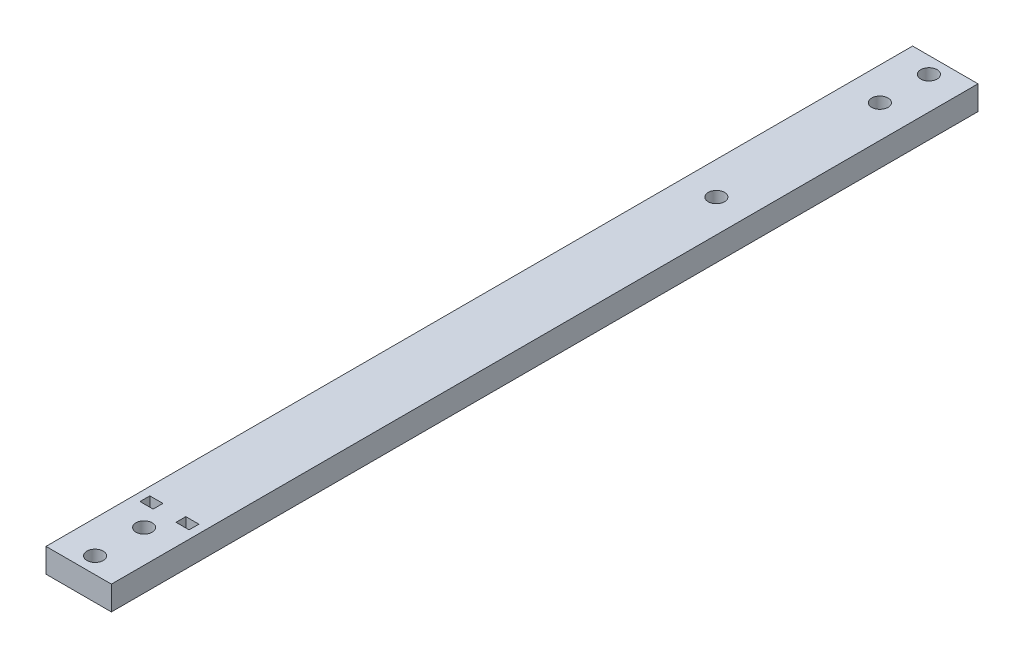
ISO-10303-21;
HEADER;
FILE_DESCRIPTION(('STEP AP214'),'2;1');
FILE_NAME('part.step','',(''),(''),'','','');
FILE_SCHEMA(('AUTOMOTIVE_DESIGN { 1 0 10303 214 1 1 1 1 }'));
ENDSEC;
DATA;
#1=APPLICATION_CONTEXT('core data for automotive mechanical design processes');
#2=APPLICATION_PROTOCOL_DEFINITION('international standard','automotive_design',2000,#1);
#3=PRODUCT_CONTEXT('',#1,'mechanical');
#4=PRODUCT('Part','Part','',(#3));
#5=PRODUCT_RELATED_PRODUCT_CATEGORY('part','',(#4));
#6=PRODUCT_DEFINITION_FORMATION('','',#4);
#7=PRODUCT_DEFINITION_CONTEXT('part definition',#1,'design');
#8=PRODUCT_DEFINITION('design','',#6,#7);
#9=PRODUCT_DEFINITION_SHAPE('','',#8);
#10=(LENGTH_UNIT() NAMED_UNIT(*) SI_UNIT(.MILLI.,.METRE.));
#11=(NAMED_UNIT(*) PLANE_ANGLE_UNIT() SI_UNIT($,.RADIAN.));
#12=(NAMED_UNIT(*) SI_UNIT($,.STERADIAN.) SOLID_ANGLE_UNIT());
#13=UNCERTAINTY_MEASURE_WITH_UNIT(LENGTH_MEASURE(1.E-05),#10,'distance_accuracy_value','');
#14=(GEOMETRIC_REPRESENTATION_CONTEXT(3) GLOBAL_UNCERTAINTY_ASSIGNED_CONTEXT((#13)) GLOBAL_UNIT_ASSIGNED_CONTEXT((#10,
#11,#12)) REPRESENTATION_CONTEXT('',''));
#15=CARTESIAN_POINT('',(0.,0.,0.));
#16=DIRECTION('',(0.,0.,1.));
#17=DIRECTION('',(1.,0.,0.));
#18=AXIS2_PLACEMENT_3D('',#15,#16,#17);
#19=CARTESIAN_POINT('',(0.,2.95,0.));
#20=DIRECTION('',(0.,1.,0.));
#21=DIRECTION('',(0.,0.,1.));
#22=AXIS2_PLACEMENT_3D('',#19,#20,#21);
#23=PLANE('',#22);
#24=CARTESIAN_POINT('',(4.,2.95,2.));
#25=DIRECTION('',(0.,1.,0.));
#26=DIRECTION('',(0.,0.,1.));
#27=AXIS2_PLACEMENT_3D('',#24,#25,#26);
#28=CIRCLE('',#27,1.);
#29=CARTESIAN_POINT('',(4.,2.95,3.));
#30=VERTEX_POINT('',#29);
#31=EDGE_CURVE('E206',#30,#30,#28,.T.);
#32=ORIENTED_EDGE('',*,*,#31,.F.);
#33=EDGE_LOOP('',(#32));
#34=FACE_BOUND('',#33,.T.);
#35=CARTESIAN_POINT('',(4.00000000000001,2.95,104.));
#36=DIRECTION('',(0.,1.,0.));
#37=DIRECTION('',(0.,0.,1.));
#38=AXIS2_PLACEMENT_3D('',#35,#36,#37);
#39=CIRCLE('',#38,0.999999999999998);
#40=CARTESIAN_POINT('',(4.00000000000001,2.95,105.));
#41=VERTEX_POINT('',#40);
#42=EDGE_CURVE('E213',#41,#41,#39,.T.);
#43=ORIENTED_EDGE('',*,*,#42,.F.);
#44=EDGE_LOOP('',(#43));
#45=FACE_BOUND('',#44,.T.);
#46=CARTESIAN_POINT('',(4.00000000000001,2.95,98.));
#47=DIRECTION('',(0.,1.,0.));
#48=DIRECTION('',(0.,0.,1.));
#49=AXIS2_PLACEMENT_3D('',#46,#47,#48);
#50=CIRCLE('',#49,1.);
#51=CARTESIAN_POINT('',(4.00000000000001,2.95,99.));
#52=VERTEX_POINT('',#51);
#53=EDGE_CURVE('E194',#52,#52,#50,.T.);
#54=ORIENTED_EDGE('',*,*,#53,.F.);
#55=EDGE_LOOP('',(#54));
#56=FACE_BOUND('',#55,.T.);
#57=CARTESIAN_POINT('',(4.00000000000001,2.95,28.));
#58=DIRECTION('',(0.,1.,0.));
#59=DIRECTION('',(0.,0.,1.));
#60=AXIS2_PLACEMENT_3D('',#57,#58,#59);
#61=CIRCLE('',#60,1.);
#62=CARTESIAN_POINT('',(4.00000000000001,2.95,29.));
#63=VERTEX_POINT('',#62);
#64=EDGE_CURVE('E201',#63,#63,#61,.T.);
#65=ORIENTED_EDGE('',*,*,#64,.F.);
#66=EDGE_LOOP('',(#65));
#67=FACE_BOUND('',#66,.T.);
#68=CARTESIAN_POINT('',(4.,2.95,8.));
#69=DIRECTION('',(0.,1.,0.));
#70=DIRECTION('',(0.,0.,1.));
#71=AXIS2_PLACEMENT_3D('',#68,#69,#70);
#72=CIRCLE('',#71,1.);
#73=CARTESIAN_POINT('',(4.,2.95,9.));
#74=VERTEX_POINT('',#73);
#75=EDGE_CURVE('E209',#74,#74,#72,.T.);
#76=ORIENTED_EDGE('',*,*,#75,.F.);
#77=EDGE_LOOP('',(#76));
#78=FACE_BOUND('',#77,.T.);
#79=DIRECTION('',(0.,0.,1.));
#80=VECTOR('',#79,1.);
#81=CARTESIAN_POINT('',(0.,2.95,0.));
#82=LINE('',#81,#80);
#83=CARTESIAN_POINT('',(0.,2.95,0.));
#84=VERTEX_POINT('',#83);
#85=CARTESIAN_POINT('',(0.,2.95,106.));
#86=VERTEX_POINT('',#85);
#87=EDGE_CURVE('E240',#84,#86,#82,.T.);
#88=ORIENTED_EDGE('',*,*,#87,.T.);
#89=DIRECTION('',(1.,0.,0.));
#90=VECTOR('',#89,1.);
#91=CARTESIAN_POINT('',(0.,2.95,106.));
#92=LINE('',#91,#90);
#93=CARTESIAN_POINT('',(8.00000000000001,2.95,106.));
#94=VERTEX_POINT('',#93);
#95=EDGE_CURVE('E243',#86,#94,#92,.T.);
#96=ORIENTED_EDGE('',*,*,#95,.T.);
#97=DIRECTION('',(0.,0.,-1.));
#98=VECTOR('',#97,1.);
#99=CARTESIAN_POINT('',(8.,2.95,0.));
#100=LINE('',#99,#98);
#101=CARTESIAN_POINT('',(8.,2.95,0.));
#102=VERTEX_POINT('',#101);
#103=EDGE_CURVE('E246',#94,#102,#100,.T.);
#104=ORIENTED_EDGE('',*,*,#103,.T.);
#105=DIRECTION('',(-1.,0.,0.));
#106=VECTOR('',#105,1.);
#107=CARTESIAN_POINT('',(0.,2.95,0.));
#108=LINE('',#107,#106);
#109=EDGE_CURVE('E248',#102,#84,#108,.T.);
#110=ORIENTED_EDGE('',*,*,#109,.T.);
#111=EDGE_LOOP('',(#88,#96,#104,#110));
#112=FACE_BOUND('',#111,.T.);
#113=DIRECTION('',(1.,0.,0.));
#114=VECTOR('',#113,1.);
#115=CARTESIAN_POINT('',(0.,2.95,94.3));
#116=LINE('',#115,#114);
#117=CARTESIAN_POINT('',(5.40000000000001,2.95,94.3));
#118=VERTEX_POINT('',#117);
#119=CARTESIAN_POINT('',(7.00000000000001,2.95,94.3));
#120=VERTEX_POINT('',#119);
#121=EDGE_CURVE('E180',#118,#120,#116,.T.);
#122=ORIENTED_EDGE('',*,*,#121,.T.);
#123=DIRECTION('',(0.,0.,1.));
#124=VECTOR('',#123,1.);
#125=CARTESIAN_POINT('',(7.00000000000001,2.95,0.));
#126=LINE('',#125,#124);
#127=CARTESIAN_POINT('',(7.00000000000001,2.95,95.5));
#128=VERTEX_POINT('',#127);
#129=EDGE_CURVE('E60',#120,#128,#126,.T.);
#130=ORIENTED_EDGE('',*,*,#129,.T.);
#131=DIRECTION('',(1.,0.,0.));
#132=VECTOR('',#131,1.);
#133=CARTESIAN_POINT('',(0.,2.95,95.5));
#134=LINE('',#133,#132);
#135=CARTESIAN_POINT('',(5.40000000000001,2.95,95.5));
#136=VERTEX_POINT('',#135);
#137=EDGE_CURVE('E170',#136,#128,#134,.T.);
#138=ORIENTED_EDGE('',*,*,#137,.F.);
#139=DIRECTION('',(0.,0.,1.));
#140=VECTOR('',#139,1.);
#141=CARTESIAN_POINT('',(5.40000000000001,2.95,0.));
#142=LINE('',#141,#140);
#143=EDGE_CURVE('E183',#118,#136,#142,.T.);
#144=ORIENTED_EDGE('',*,*,#143,.F.);
#145=EDGE_LOOP('',(#122,#130,#138,#144));
#146=FACE_BOUND('',#145,.T.);
#147=DIRECTION('',(1.,0.,0.));
#148=VECTOR('',#147,1.);
#149=CARTESIAN_POINT('',(0.,2.95,94.3));
#150=LINE('',#149,#148);
#151=CARTESIAN_POINT('',(1.,2.95,94.3));
#152=VERTEX_POINT('',#151);
#153=CARTESIAN_POINT('',(2.6,2.95,94.3));
#154=VERTEX_POINT('',#153);
#155=EDGE_CURVE('E156',#152,#154,#150,.T.);
#156=ORIENTED_EDGE('',*,*,#155,.T.);
#157=DIRECTION('',(0.,0.,1.));
#158=VECTOR('',#157,1.);
#159=CARTESIAN_POINT('',(2.6,2.95,0.));
#160=LINE('',#159,#158);
#161=CARTESIAN_POINT('',(2.6,2.95,95.5));
#162=VERTEX_POINT('',#161);
#163=EDGE_CURVE('E52',#154,#162,#160,.T.);
#164=ORIENTED_EDGE('',*,*,#163,.T.);
#165=DIRECTION('',(1.,0.,0.));
#166=VECTOR('',#165,1.);
#167=CARTESIAN_POINT('',(0.,2.95,95.5));
#168=LINE('',#167,#166);
#169=CARTESIAN_POINT('',(1.,2.95,95.5));
#170=VERTEX_POINT('',#169);
#171=EDGE_CURVE('E147',#170,#162,#168,.T.);
#172=ORIENTED_EDGE('',*,*,#171,.F.);
#173=DIRECTION('',(0.,0.,1.));
#174=VECTOR('',#173,1.);
#175=CARTESIAN_POINT('',(0.999999999999983,2.95,0.));
#176=LINE('',#175,#174);
#177=EDGE_CURVE('E150',#152,#170,#176,.T.);
#178=ORIENTED_EDGE('',*,*,#177,.F.);
#179=EDGE_LOOP('',(#156,#164,#172,#178));
#180=FACE_BOUND('',#179,.T.);
#181=ADVANCED_FACE('F35',(#34,#45,#56,#67,#78,#112,#146,#180),#23,.T.);
#182=CARTESIAN_POINT('',(0.,0.,0.));
#183=DIRECTION('',(0.,1.,0.));
#184=DIRECTION('',(0.,0.,1.));
#185=AXIS2_PLACEMENT_3D('',#182,#183,#184);
#186=PLANE('',#185);
#187=DIRECTION('',(0.,0.,1.));
#188=VECTOR('',#187,1.);
#189=CARTESIAN_POINT('',(7.00000000000001,0.,0.));
#190=LINE('',#189,#188);
#191=CARTESIAN_POINT('',(7.00000000000001,0.,94.3));
#192=VERTEX_POINT('',#191);
#193=CARTESIAN_POINT('',(7.00000000000001,0.,95.5));
#194=VERTEX_POINT('',#193);
#195=EDGE_CURVE('E167',#192,#194,#190,.T.);
#196=ORIENTED_EDGE('',*,*,#195,.F.);
#197=DIRECTION('',(1.,0.,0.));
#198=VECTOR('',#197,1.);
#199=CARTESIAN_POINT('',(0.,0.,94.3));
#200=LINE('',#199,#198);
#201=CARTESIAN_POINT('',(5.40000000000001,0.,94.3));
#202=VERTEX_POINT('',#201);
#203=EDGE_CURVE('E169',#202,#192,#200,.T.);
#204=ORIENTED_EDGE('',*,*,#203,.F.);
#205=DIRECTION('',(0.,0.,1.));
#206=VECTOR('',#205,1.);
#207=CARTESIAN_POINT('',(5.40000000000001,0.,0.));
#208=LINE('',#207,#206);
#209=CARTESIAN_POINT('',(5.40000000000001,0.,95.5));
#210=VERTEX_POINT('',#209);
#211=EDGE_CURVE('E172',#202,#210,#208,.T.);
#212=ORIENTED_EDGE('',*,*,#211,.T.);
#213=DIRECTION('',(1.,0.,0.));
#214=VECTOR('',#213,1.);
#215=CARTESIAN_POINT('',(0.,0.,95.5));
#216=LINE('',#215,#214);
#217=EDGE_CURVE('E175',#210,#194,#216,.T.);
#218=ORIENTED_EDGE('',*,*,#217,.T.);
#219=EDGE_LOOP('',(#196,#204,#212,#218));
#220=FACE_BOUND('',#219,.T.);
#221=CARTESIAN_POINT('',(4.,0.,2.));
#222=DIRECTION('',(0.,1.,0.));
#223=DIRECTION('',(0.,0.,1.));
#224=AXIS2_PLACEMENT_3D('',#221,#222,#223);
#225=CIRCLE('',#224,0.7);
#226=CARTESIAN_POINT('',(4.,0.,2.7));
#227=VERTEX_POINT('',#226);
#228=EDGE_CURVE('E224',#227,#227,#225,.T.);
#229=ORIENTED_EDGE('',*,*,#228,.T.);
#230=EDGE_LOOP('',(#229));
#231=FACE_BOUND('',#230,.T.);
#232=CARTESIAN_POINT('',(4.00000000000001,0.,28.));
#233=DIRECTION('',(0.,1.,0.));
#234=DIRECTION('',(0.,0.,1.));
#235=AXIS2_PLACEMENT_3D('',#232,#233,#234);
#236=CIRCLE('',#235,0.699999999999998);
#237=CARTESIAN_POINT('',(4.00000000000001,0.,28.7));
#238=VERTEX_POINT('',#237);
#239=EDGE_CURVE('E233',#238,#238,#236,.T.);
#240=ORIENTED_EDGE('',*,*,#239,.T.);
#241=EDGE_LOOP('',(#240));
#242=FACE_BOUND('',#241,.T.);
#243=CARTESIAN_POINT('',(4.00000000000001,0.,104.));
#244=DIRECTION('',(0.,1.,0.));
#245=DIRECTION('',(0.,0.,1.));
#246=AXIS2_PLACEMENT_3D('',#243,#244,#245);
#247=CIRCLE('',#246,0.700000000000016);
#248=CARTESIAN_POINT('',(4.00000000000001,0.,104.7));
#249=VERTEX_POINT('',#248);
#250=EDGE_CURVE('E229',#249,#249,#247,.T.);
#251=ORIENTED_EDGE('',*,*,#250,.T.);
#252=EDGE_LOOP('',(#251));
#253=FACE_BOUND('',#252,.T.);
#254=CARTESIAN_POINT('',(4.00000000000001,0.,98.));
#255=DIRECTION('',(0.,1.,0.));
#256=DIRECTION('',(0.,0.,1.));
#257=AXIS2_PLACEMENT_3D('',#254,#255,#256);
#258=CIRCLE('',#257,0.700000000000018);
#259=CARTESIAN_POINT('',(4.00000000000001,0.,98.7));
#260=VERTEX_POINT('',#259);
#261=EDGE_CURVE('E232',#260,#260,#258,.T.);
#262=ORIENTED_EDGE('',*,*,#261,.T.);
#263=EDGE_LOOP('',(#262));
#264=FACE_BOUND('',#263,.T.);
#265=CARTESIAN_POINT('',(4.,0.,8.));
#266=DIRECTION('',(0.,1.,0.));
#267=DIRECTION('',(0.,0.,1.));
#268=AXIS2_PLACEMENT_3D('',#265,#266,#267);
#269=CIRCLE('',#268,0.7);
#270=CARTESIAN_POINT('',(4.,0.,8.7));
#271=VERTEX_POINT('',#270);
#272=EDGE_CURVE('E228',#271,#271,#269,.T.);
#273=ORIENTED_EDGE('',*,*,#272,.T.);
#274=EDGE_LOOP('',(#273));
#275=FACE_BOUND('',#274,.T.);
#276=DIRECTION('',(0.,0.,1.));
#277=VECTOR('',#276,1.);
#278=CARTESIAN_POINT('',(0.,0.,0.));
#279=LINE('',#278,#277);
#280=CARTESIAN_POINT('',(0.,0.,0.));
#281=VERTEX_POINT('',#280);
#282=CARTESIAN_POINT('',(0.,0.,106.));
#283=VERTEX_POINT('',#282);
#284=EDGE_CURVE('E227',#281,#283,#279,.T.);
#285=ORIENTED_EDGE('',*,*,#284,.F.);
#286=DIRECTION('',(-1.,0.,0.));
#287=VECTOR('',#286,1.);
#288=CARTESIAN_POINT('',(0.,0.,0.));
#289=LINE('',#288,#287);
#290=CARTESIAN_POINT('',(8.,0.,0.));
#291=VERTEX_POINT('',#290);
#292=EDGE_CURVE('E244',#291,#281,#289,.T.);
#293=ORIENTED_EDGE('',*,*,#292,.F.);
#294=DIRECTION('',(0.,0.,-1.));
#295=VECTOR('',#294,1.);
#296=CARTESIAN_POINT('',(8.,0.,0.));
#297=LINE('',#296,#295);
#298=CARTESIAN_POINT('',(8.00000000000001,0.,106.));
#299=VERTEX_POINT('',#298);
#300=EDGE_CURVE('E255',#299,#291,#297,.T.);
#301=ORIENTED_EDGE('',*,*,#300,.F.);
#302=DIRECTION('',(1.,0.,0.));
#303=VECTOR('',#302,1.);
#304=CARTESIAN_POINT('',(0.,0.,106.));
#305=LINE('',#304,#303);
#306=EDGE_CURVE('E253',#283,#299,#305,.T.);
#307=ORIENTED_EDGE('',*,*,#306,.F.);
#308=EDGE_LOOP('',(#285,#293,#301,#307));
#309=FACE_BOUND('',#308,.T.);
#310=DIRECTION('',(0.,0.,1.));
#311=VECTOR('',#310,1.);
#312=CARTESIAN_POINT('',(2.6,0.,0.));
#313=LINE('',#312,#311);
#314=CARTESIAN_POINT('',(2.6,0.,94.3));
#315=VERTEX_POINT('',#314);
#316=CARTESIAN_POINT('',(2.6,0.,95.5));
#317=VERTEX_POINT('',#316);
#318=EDGE_CURVE('E138',#315,#317,#313,.T.);
#319=ORIENTED_EDGE('',*,*,#318,.F.);
#320=DIRECTION('',(1.,0.,0.));
#321=VECTOR('',#320,1.);
#322=CARTESIAN_POINT('',(0.,0.,94.3));
#323=LINE('',#322,#321);
#324=CARTESIAN_POINT('',(1.,0.,94.3));
#325=VERTEX_POINT('',#324);
#326=EDGE_CURVE('E128',#325,#315,#323,.T.);
#327=ORIENTED_EDGE('',*,*,#326,.F.);
#328=DIRECTION('',(0.,0.,1.));
#329=VECTOR('',#328,1.);
#330=CARTESIAN_POINT('',(0.999999999999983,0.,0.));
#331=LINE('',#330,#329);
#332=CARTESIAN_POINT('',(1.,0.,95.5));
#333=VERTEX_POINT('',#332);
#334=EDGE_CURVE('E137',#325,#333,#331,.T.);
#335=ORIENTED_EDGE('',*,*,#334,.T.);
#336=DIRECTION('',(1.,0.,0.));
#337=VECTOR('',#336,1.);
#338=CARTESIAN_POINT('',(0.,0.,95.5));
#339=LINE('',#338,#337);
#340=EDGE_CURVE('E142',#333,#317,#339,.T.);
#341=ORIENTED_EDGE('',*,*,#340,.T.);
#342=EDGE_LOOP('',(#319,#327,#335,#341));
#343=FACE_BOUND('',#342,.T.);
#344=ADVANCED_FACE('F145',(#220,#231,#242,#253,#264,#275,#309,#343),#186,.F.);
#345=CARTESIAN_POINT('',(4.,0.,8.));
#346=DIRECTION('',(0.,1.,0.));
#347=DIRECTION('',(0.,0.,1.));
#348=AXIS2_PLACEMENT_3D('',#345,#346,#347);
#349=CYLINDRICAL_SURFACE('',#348,0.7);
#350=ORIENTED_EDGE('',*,*,#272,.F.);
#351=EDGE_LOOP('',(#350));
#352=FACE_BOUND('',#351,.T.);
#353=CARTESIAN_POINT('',(4.,1.45,8.));
#354=DIRECTION('',(0.,1.,0.));
#355=DIRECTION('',(0.,0.,1.));
#356=AXIS2_PLACEMENT_3D('',#353,#354,#355);
#357=CIRCLE('',#356,0.7);
#358=CARTESIAN_POINT('',(4.,1.45,8.7));
#359=VERTEX_POINT('',#358);
#360=EDGE_CURVE('E39',#359,#359,#357,.F.);
#361=ORIENTED_EDGE('',*,*,#360,.F.);
#362=EDGE_LOOP('',(#361));
#363=FACE_BOUND('',#362,.T.);
#364=ADVANCED_FACE('F281',(#352,#363),#349,.F.);
#365=CARTESIAN_POINT('',(4.00000000000001,0.,98.));
#366=DIRECTION('',(0.,1.,0.));
#367=DIRECTION('',(0.,0.,1.));
#368=AXIS2_PLACEMENT_3D('',#365,#366,#367);
#369=CYLINDRICAL_SURFACE('',#368,0.700000000000018);
#370=ORIENTED_EDGE('',*,*,#261,.F.);
#371=EDGE_LOOP('',(#370));
#372=FACE_BOUND('',#371,.T.);
#373=CARTESIAN_POINT('',(4.00000000000001,1.45,98.));
#374=DIRECTION('',(0.,1.,0.));
#375=DIRECTION('',(0.,0.,1.));
#376=AXIS2_PLACEMENT_3D('',#373,#374,#375);
#377=CIRCLE('',#376,0.700000000000018);
#378=CARTESIAN_POINT('',(4.00000000000001,1.45,98.7));
#379=VERTEX_POINT('',#378);
#380=EDGE_CURVE('E272',#379,#379,#377,.F.);
#381=ORIENTED_EDGE('',*,*,#380,.F.);
#382=EDGE_LOOP('',(#381));
#383=FACE_BOUND('',#382,.T.);
#384=ADVANCED_FACE('F283',(#372,#383),#369,.F.);
#385=CARTESIAN_POINT('',(4.00000000000001,0.,104.));
#386=DIRECTION('',(0.,1.,0.));
#387=DIRECTION('',(0.,0.,1.));
#388=AXIS2_PLACEMENT_3D('',#385,#386,#387);
#389=CYLINDRICAL_SURFACE('',#388,0.700000000000016);
#390=ORIENTED_EDGE('',*,*,#250,.F.);
#391=EDGE_LOOP('',(#390));
#392=FACE_BOUND('',#391,.T.);
#393=CARTESIAN_POINT('',(4.00000000000001,1.45,104.));
#394=DIRECTION('',(0.,1.,0.));
#395=DIRECTION('',(0.,0.,1.));
#396=AXIS2_PLACEMENT_3D('',#393,#394,#395);
#397=CIRCLE('',#396,0.700000000000016);
#398=CARTESIAN_POINT('',(4.00000000000001,1.45,104.7));
#399=VERTEX_POINT('',#398);
#400=EDGE_CURVE('E270',#399,#399,#397,.F.);
#401=ORIENTED_EDGE('',*,*,#400,.F.);
#402=EDGE_LOOP('',(#401));
#403=FACE_BOUND('',#402,.T.);
#404=ADVANCED_FACE('F290',(#392,#403),#389,.F.);
#405=CARTESIAN_POINT('',(4.00000000000001,0.,28.));
#406=DIRECTION('',(0.,1.,0.));
#407=DIRECTION('',(0.,0.,1.));
#408=AXIS2_PLACEMENT_3D('',#405,#406,#407);
#409=CYLINDRICAL_SURFACE('',#408,0.699999999999998);
#410=ORIENTED_EDGE('',*,*,#239,.F.);
#411=EDGE_LOOP('',(#410));
#412=FACE_BOUND('',#411,.T.);
#413=CARTESIAN_POINT('',(4.00000000000001,1.45,28.));
#414=DIRECTION('',(0.,1.,0.));
#415=DIRECTION('',(0.,0.,1.));
#416=AXIS2_PLACEMENT_3D('',#413,#414,#415);
#417=CIRCLE('',#416,0.699999999999998);
#418=CARTESIAN_POINT('',(4.00000000000001,1.45,28.7));
#419=VERTEX_POINT('',#418);
#420=EDGE_CURVE('E267',#419,#419,#417,.F.);
#421=ORIENTED_EDGE('',*,*,#420,.F.);
#422=EDGE_LOOP('',(#421));
#423=FACE_BOUND('',#422,.T.);
#424=ADVANCED_FACE('F409',(#412,#423),#409,.F.);
#425=CARTESIAN_POINT('',(4.,0.,2.));
#426=DIRECTION('',(0.,1.,0.));
#427=DIRECTION('',(0.,0.,1.));
#428=AXIS2_PLACEMENT_3D('',#425,#426,#427);
#429=CYLINDRICAL_SURFACE('',#428,0.7);
#430=ORIENTED_EDGE('',*,*,#228,.F.);
#431=EDGE_LOOP('',(#430));
#432=FACE_BOUND('',#431,.T.);
#433=CARTESIAN_POINT('',(4.,1.45,2.));
#434=DIRECTION('',(0.,1.,0.));
#435=DIRECTION('',(0.,0.,1.));
#436=AXIS2_PLACEMENT_3D('',#433,#434,#435);
#437=CIRCLE('',#436,0.7);
#438=CARTESIAN_POINT('',(4.,1.45,2.7));
#439=VERTEX_POINT('',#438);
#440=EDGE_CURVE('E221',#439,#439,#437,.F.);
#441=ORIENTED_EDGE('',*,*,#440,.F.);
#442=EDGE_LOOP('',(#441));
#443=FACE_BOUND('',#442,.T.);
#444=ADVANCED_FACE('F319',(#432,#443),#429,.F.);
#445=CARTESIAN_POINT('',(0.,2.95,0.));
#446=DIRECTION('',(1.,0.,0.));
#447=DIRECTION('',(0.,0.,-1.));
#448=AXIS2_PLACEMENT_3D('',#445,#446,#447);
#449=PLANE('',#448);
#450=ORIENTED_EDGE('',*,*,#284,.T.);
#451=DIRECTION('',(0.,-1.,0.));
#452=VECTOR('',#451,1.);
#453=CARTESIAN_POINT('',(0.,2.95,106.));
#454=LINE('',#453,#452);
#455=EDGE_CURVE('E11',#86,#283,#454,.T.);
#456=ORIENTED_EDGE('',*,*,#455,.F.);
#457=ORIENTED_EDGE('',*,*,#87,.F.);
#458=DIRECTION('',(0.,-1.,0.));
#459=VECTOR('',#458,1.);
#460=CARTESIAN_POINT('',(0.,2.95,0.));
#461=LINE('',#460,#459);
#462=EDGE_CURVE('E250',#84,#281,#461,.T.);
#463=ORIENTED_EDGE('',*,*,#462,.T.);
#464=EDGE_LOOP('',(#450,#456,#457,#463));
#465=FACE_BOUND('',#464,.T.);
#466=ADVANCED_FACE('F37',(#465),#449,.F.);
#467=CARTESIAN_POINT('',(0.,2.95,106.));
#468=DIRECTION('',(0.,0.,-1.));
#469=DIRECTION('',(-1.,0.,0.));
#470=AXIS2_PLACEMENT_3D('',#467,#468,#469);
#471=PLANE('',#470);
#472=ORIENTED_EDGE('',*,*,#306,.T.);
#473=DIRECTION('',(0.,-1.,0.));
#474=VECTOR('',#473,1.);
#475=CARTESIAN_POINT('',(8.00000000000001,2.95,106.));
#476=LINE('',#475,#474);
#477=EDGE_CURVE('E44',#94,#299,#476,.T.);
#478=ORIENTED_EDGE('',*,*,#477,.F.);
#479=ORIENTED_EDGE('',*,*,#95,.F.);
#480=ORIENTED_EDGE('',*,*,#455,.T.);
#481=EDGE_LOOP('',(#472,#478,#479,#480));
#482=FACE_BOUND('',#481,.T.);
#483=ADVANCED_FACE('F312',(#482),#471,.F.);
#484=CARTESIAN_POINT('',(8.,2.95,0.));
#485=DIRECTION('',(-1.,0.,0.));
#486=DIRECTION('',(0.,0.,1.));
#487=AXIS2_PLACEMENT_3D('',#484,#485,#486);
#488=PLANE('',#487);
#489=ORIENTED_EDGE('',*,*,#300,.T.);
#490=DIRECTION('',(0.,-1.,0.));
#491=VECTOR('',#490,1.);
#492=CARTESIAN_POINT('',(8.,2.95,0.));
#493=LINE('',#492,#491);
#494=EDGE_CURVE('E260',#102,#291,#493,.T.);
#495=ORIENTED_EDGE('',*,*,#494,.F.);
#496=ORIENTED_EDGE('',*,*,#103,.F.);
#497=ORIENTED_EDGE('',*,*,#477,.T.);
#498=EDGE_LOOP('',(#489,#495,#496,#497));
#499=FACE_BOUND('',#498,.T.);
#500=ADVANCED_FACE('F309',(#499),#488,.F.);
#501=CARTESIAN_POINT('',(0.,2.95,0.));
#502=DIRECTION('',(0.,0.,1.));
#503=DIRECTION('',(1.,0.,0.));
#504=AXIS2_PLACEMENT_3D('',#501,#502,#503);
#505=PLANE('',#504);
#506=ORIENTED_EDGE('',*,*,#292,.T.);
#507=ORIENTED_EDGE('',*,*,#462,.F.);
#508=ORIENTED_EDGE('',*,*,#109,.F.);
#509=ORIENTED_EDGE('',*,*,#494,.T.);
#510=EDGE_LOOP('',(#506,#507,#508,#509));
#511=FACE_BOUND('',#510,.T.);
#512=ADVANCED_FACE('F305',(#511),#505,.F.);
#513=CARTESIAN_POINT('',(4.,1.45,2.));
#514=DIRECTION('',(0.,1.,0.));
#515=DIRECTION('',(0.,0.,1.));
#516=AXIS2_PLACEMENT_3D('',#513,#514,#515);
#517=PLANE('',#516);
#518=CARTESIAN_POINT('',(4.,1.45,2.));
#519=DIRECTION('',(0.,1.,0.));
#520=DIRECTION('',(0.,0.,1.));
#521=AXIS2_PLACEMENT_3D('',#518,#519,#520);
#522=CIRCLE('',#521,1.);
#523=CARTESIAN_POINT('',(4.,1.45,3.));
#524=VERTEX_POINT('',#523);
#525=EDGE_CURVE('E210',#524,#524,#522,.T.);
#526=ORIENTED_EDGE('',*,*,#525,.T.);
#527=EDGE_LOOP('',(#526));
#528=FACE_BOUND('',#527,.T.);
#529=ORIENTED_EDGE('',*,*,#440,.T.);
#530=EDGE_LOOP('',(#529));
#531=FACE_BOUND('',#530,.T.);
#532=ADVANCED_FACE('F308',(#528,#531),#517,.T.);
#533=CARTESIAN_POINT('',(4.,1.45,2.));
#534=DIRECTION('',(0.,1.,0.));
#535=DIRECTION('',(0.,0.,1.));
#536=AXIS2_PLACEMENT_3D('',#533,#534,#535);
#537=CYLINDRICAL_SURFACE('',#536,1.);
#538=ORIENTED_EDGE('',*,*,#525,.F.);
#539=EDGE_LOOP('',(#538));
#540=FACE_BOUND('',#539,.T.);
#541=ORIENTED_EDGE('',*,*,#31,.T.);
#542=EDGE_LOOP('',(#541));
#543=FACE_BOUND('',#542,.T.);
#544=ADVANCED_FACE('F387',(#540,#543),#537,.F.);
#545=CARTESIAN_POINT('',(4.00000000000001,1.45,28.));
#546=DIRECTION('',(0.,1.,0.));
#547=DIRECTION('',(0.,0.,1.));
#548=AXIS2_PLACEMENT_3D('',#545,#546,#547);
#549=PLANE('',#548);
#550=CARTESIAN_POINT('',(4.00000000000001,1.45,28.));
#551=DIRECTION('',(0.,1.,0.));
#552=DIRECTION('',(0.,0.,1.));
#553=AXIS2_PLACEMENT_3D('',#550,#551,#552);
#554=CIRCLE('',#553,1.);
#555=CARTESIAN_POINT('',(4.00000000000001,1.45,29.));
#556=VERTEX_POINT('',#555);
#557=EDGE_CURVE('E163',#556,#556,#554,.T.);
#558=ORIENTED_EDGE('',*,*,#557,.T.);
#559=EDGE_LOOP('',(#558));
#560=FACE_BOUND('',#559,.T.);
#561=ORIENTED_EDGE('',*,*,#420,.T.);
#562=EDGE_LOOP('',(#561));
#563=FACE_BOUND('',#562,.T.);
#564=ADVANCED_FACE('F383',(#560,#563),#549,.T.);
#565=CARTESIAN_POINT('',(4.00000000000001,1.45,28.));
#566=DIRECTION('',(0.,1.,0.));
#567=DIRECTION('',(0.,0.,1.));
#568=AXIS2_PLACEMENT_3D('',#565,#566,#567);
#569=CYLINDRICAL_SURFACE('',#568,1.);
#570=ORIENTED_EDGE('',*,*,#557,.F.);
#571=EDGE_LOOP('',(#570));
#572=FACE_BOUND('',#571,.T.);
#573=ORIENTED_EDGE('',*,*,#64,.T.);
#574=EDGE_LOOP('',(#573));
#575=FACE_BOUND('',#574,.T.);
#576=ADVANCED_FACE('F379',(#572,#575),#569,.F.);
#577=CARTESIAN_POINT('',(4.00000000000001,1.45,104.));
#578=DIRECTION('',(0.,1.,0.));
#579=DIRECTION('',(0.,0.,1.));
#580=AXIS2_PLACEMENT_3D('',#577,#578,#579);
#581=PLANE('',#580);
#582=CARTESIAN_POINT('',(4.00000000000001,1.45,104.));
#583=DIRECTION('',(0.,1.,0.));
#584=DIRECTION('',(0.,0.,1.));
#585=AXIS2_PLACEMENT_3D('',#582,#583,#584);
#586=CIRCLE('',#585,0.999999999999998);
#587=CARTESIAN_POINT('',(4.00000000000001,1.45,105.));
#588=VERTEX_POINT('',#587);
#589=EDGE_CURVE('E197',#588,#588,#586,.T.);
#590=ORIENTED_EDGE('',*,*,#589,.T.);
#591=EDGE_LOOP('',(#590));
#592=FACE_BOUND('',#591,.T.);
#593=ORIENTED_EDGE('',*,*,#400,.T.);
#594=EDGE_LOOP('',(#593));
#595=FACE_BOUND('',#594,.T.);
#596=ADVANCED_FACE('F382',(#592,#595),#581,.T.);
#597=CARTESIAN_POINT('',(4.00000000000001,1.45,104.));
#598=DIRECTION('',(0.,1.,0.));
#599=DIRECTION('',(0.,0.,1.));
#600=AXIS2_PLACEMENT_3D('',#597,#598,#599);
#601=CYLINDRICAL_SURFACE('',#600,0.999999999999998);
#602=ORIENTED_EDGE('',*,*,#589,.F.);
#603=EDGE_LOOP('',(#602));
#604=FACE_BOUND('',#603,.T.);
#605=ORIENTED_EDGE('',*,*,#42,.T.);
#606=EDGE_LOOP('',(#605));
#607=FACE_BOUND('',#606,.T.);
#608=ADVANCED_FACE('F377',(#604,#607),#601,.F.);
#609=CARTESIAN_POINT('',(4.00000000000001,1.45,98.));
#610=DIRECTION('',(0.,1.,0.));
#611=DIRECTION('',(0.,0.,1.));
#612=AXIS2_PLACEMENT_3D('',#609,#610,#611);
#613=PLANE('',#612);
#614=CARTESIAN_POINT('',(4.00000000000001,1.45,98.));
#615=DIRECTION('',(0.,1.,0.));
#616=DIRECTION('',(0.,0.,1.));
#617=AXIS2_PLACEMENT_3D('',#614,#615,#616);
#618=CIRCLE('',#617,1.);
#619=CARTESIAN_POINT('',(4.00000000000001,1.45,99.));
#620=VERTEX_POINT('',#619);
#621=EDGE_CURVE('E198',#620,#620,#618,.T.);
#622=ORIENTED_EDGE('',*,*,#621,.T.);
#623=EDGE_LOOP('',(#622));
#624=FACE_BOUND('',#623,.T.);
#625=ORIENTED_EDGE('',*,*,#380,.T.);
#626=EDGE_LOOP('',(#625));
#627=FACE_BOUND('',#626,.T.);
#628=ADVANCED_FACE('F373',(#624,#627),#613,.T.);
#629=CARTESIAN_POINT('',(4.00000000000001,1.45,98.));
#630=DIRECTION('',(0.,1.,0.));
#631=DIRECTION('',(0.,0.,1.));
#632=AXIS2_PLACEMENT_3D('',#629,#630,#631);
#633=CYLINDRICAL_SURFACE('',#632,1.);
#634=ORIENTED_EDGE('',*,*,#621,.F.);
#635=EDGE_LOOP('',(#634));
#636=FACE_BOUND('',#635,.T.);
#637=ORIENTED_EDGE('',*,*,#53,.T.);
#638=EDGE_LOOP('',(#637));
#639=FACE_BOUND('',#638,.T.);
#640=ADVANCED_FACE('F370',(#636,#639),#633,.F.);
#641=CARTESIAN_POINT('',(4.,1.45,8.));
#642=DIRECTION('',(0.,1.,0.));
#643=DIRECTION('',(0.,0.,1.));
#644=AXIS2_PLACEMENT_3D('',#641,#642,#643);
#645=PLANE('',#644);
#646=CARTESIAN_POINT('',(4.,1.45,8.));
#647=DIRECTION('',(0.,1.,0.));
#648=DIRECTION('',(0.,0.,1.));
#649=AXIS2_PLACEMENT_3D('',#646,#647,#648);
#650=CIRCLE('',#649,1.);
#651=CARTESIAN_POINT('',(4.,1.45,9.));
#652=VERTEX_POINT('',#651);
#653=EDGE_CURVE('E218',#652,#652,#650,.T.);
#654=ORIENTED_EDGE('',*,*,#653,.T.);
#655=EDGE_LOOP('',(#654));
#656=FACE_BOUND('',#655,.T.);
#657=ORIENTED_EDGE('',*,*,#360,.T.);
#658=EDGE_LOOP('',(#657));
#659=FACE_BOUND('',#658,.T.);
#660=ADVANCED_FACE('F279',(#656,#659),#645,.T.);
#661=CARTESIAN_POINT('',(4.,1.45,8.));
#662=DIRECTION('',(0.,1.,0.));
#663=DIRECTION('',(0.,0.,1.));
#664=AXIS2_PLACEMENT_3D('',#661,#662,#663);
#665=CYLINDRICAL_SURFACE('',#664,1.);
#666=ORIENTED_EDGE('',*,*,#653,.F.);
#667=EDGE_LOOP('',(#666));
#668=FACE_BOUND('',#667,.T.);
#669=ORIENTED_EDGE('',*,*,#75,.T.);
#670=EDGE_LOOP('',(#669));
#671=FACE_BOUND('',#670,.T.);
#672=ADVANCED_FACE('F369',(#668,#671),#665,.F.);
#673=CARTESIAN_POINT('',(7.00000000000001,0.,0.));
#674=DIRECTION('',(-1.,0.,0.));
#675=DIRECTION('',(0.,0.,1.));
#676=AXIS2_PLACEMENT_3D('',#673,#674,#675);
#677=PLANE('',#676);
#678=ORIENTED_EDGE('',*,*,#129,.F.);
#679=DIRECTION('',(0.,1.,0.));
#680=VECTOR('',#679,1.);
#681=CARTESIAN_POINT('',(7.00000000000001,0.,94.3));
#682=LINE('',#681,#680);
#683=EDGE_CURVE('E178',#192,#120,#682,.T.);
#684=ORIENTED_EDGE('',*,*,#683,.F.);
#685=ORIENTED_EDGE('',*,*,#195,.T.);
#686=DIRECTION('',(0.,1.,0.));
#687=VECTOR('',#686,1.);
#688=CARTESIAN_POINT('',(7.00000000000001,0.,95.5));
#689=LINE('',#688,#687);
#690=EDGE_CURVE('E157',#194,#128,#689,.T.);
#691=ORIENTED_EDGE('',*,*,#690,.T.);
#692=EDGE_LOOP('',(#678,#684,#685,#691));
#693=FACE_BOUND('',#692,.T.);
#694=ADVANCED_FACE('F359',(#693),#677,.T.);
#695=CARTESIAN_POINT('',(0.,0.,95.5));
#696=DIRECTION('',(0.,0.,1.));
#697=DIRECTION('',(1.,0.,0.));
#698=AXIS2_PLACEMENT_3D('',#695,#696,#697);
#699=PLANE('',#698);
#700=ORIENTED_EDGE('',*,*,#137,.T.);
#701=ORIENTED_EDGE('',*,*,#690,.F.);
#702=ORIENTED_EDGE('',*,*,#217,.F.);
#703=DIRECTION('',(0.,1.,0.));
#704=VECTOR('',#703,1.);
#705=CARTESIAN_POINT('',(5.40000000000001,0.,95.5));
#706=LINE('',#705,#704);
#707=EDGE_CURVE('E189',#210,#136,#706,.T.);
#708=ORIENTED_EDGE('',*,*,#707,.T.);
#709=EDGE_LOOP('',(#700,#701,#702,#708));
#710=FACE_BOUND('',#709,.T.);
#711=ADVANCED_FACE('F355',(#710),#699,.F.);
#712=CARTESIAN_POINT('',(5.40000000000001,0.,0.));
#713=DIRECTION('',(-1.,0.,0.));
#714=DIRECTION('',(0.,0.,1.));
#715=AXIS2_PLACEMENT_3D('',#712,#713,#714);
#716=PLANE('',#715);
#717=ORIENTED_EDGE('',*,*,#143,.T.);
#718=ORIENTED_EDGE('',*,*,#707,.F.);
#719=ORIENTED_EDGE('',*,*,#211,.F.);
#720=DIRECTION('',(0.,1.,0.));
#721=VECTOR('',#720,1.);
#722=CARTESIAN_POINT('',(5.40000000000001,0.,94.3));
#723=LINE('',#722,#721);
#724=EDGE_CURVE('E191',#202,#118,#723,.T.);
#725=ORIENTED_EDGE('',*,*,#724,.T.);
#726=EDGE_LOOP('',(#717,#718,#719,#725));
#727=FACE_BOUND('',#726,.T.);
#728=ADVANCED_FACE('F358',(#727),#716,.F.);
#729=CARTESIAN_POINT('',(0.,0.,94.3));
#730=DIRECTION('',(0.,0.,1.));
#731=DIRECTION('',(1.,0.,0.));
#732=AXIS2_PLACEMENT_3D('',#729,#730,#731);
#733=PLANE('',#732);
#734=ORIENTED_EDGE('',*,*,#121,.F.);
#735=ORIENTED_EDGE('',*,*,#724,.F.);
#736=ORIENTED_EDGE('',*,*,#203,.T.);
#737=ORIENTED_EDGE('',*,*,#683,.T.);
#738=EDGE_LOOP('',(#734,#735,#736,#737));
#739=FACE_BOUND('',#738,.T.);
#740=ADVANCED_FACE('F350',(#739),#733,.T.);
#741=CARTESIAN_POINT('',(2.6,0.,0.));
#742=DIRECTION('',(-1.,0.,0.));
#743=DIRECTION('',(0.,0.,1.));
#744=AXIS2_PLACEMENT_3D('',#741,#742,#743);
#745=PLANE('',#744);
#746=ORIENTED_EDGE('',*,*,#163,.F.);
#747=DIRECTION('',(0.,1.,0.));
#748=VECTOR('',#747,1.);
#749=CARTESIAN_POINT('',(2.6,0.,94.3));
#750=LINE('',#749,#748);
#751=EDGE_CURVE('E131',#315,#154,#750,.T.);
#752=ORIENTED_EDGE('',*,*,#751,.F.);
#753=ORIENTED_EDGE('',*,*,#318,.T.);
#754=DIRECTION('',(0.,1.,0.));
#755=VECTOR('',#754,1.);
#756=CARTESIAN_POINT('',(2.6,0.,95.5));
#757=LINE('',#756,#755);
#758=EDGE_CURVE('E161',#317,#162,#757,.T.);
#759=ORIENTED_EDGE('',*,*,#758,.T.);
#760=EDGE_LOOP('',(#746,#752,#753,#759));
#761=FACE_BOUND('',#760,.T.);
#762=ADVANCED_FACE('F140',(#761),#745,.T.);
#763=CARTESIAN_POINT('',(0.,0.,95.5));
#764=DIRECTION('',(0.,0.,1.));
#765=DIRECTION('',(1.,0.,0.));
#766=AXIS2_PLACEMENT_3D('',#763,#764,#765);
#767=PLANE('',#766);
#768=ORIENTED_EDGE('',*,*,#171,.T.);
#769=ORIENTED_EDGE('',*,*,#758,.F.);
#770=ORIENTED_EDGE('',*,*,#340,.F.);
#771=DIRECTION('',(0.,1.,0.));
#772=VECTOR('',#771,1.);
#773=CARTESIAN_POINT('',(1.,0.,95.5));
#774=LINE('',#773,#772);
#775=EDGE_CURVE('E164',#333,#170,#774,.T.);
#776=ORIENTED_EDGE('',*,*,#775,.T.);
#777=EDGE_LOOP('',(#768,#769,#770,#776));
#778=FACE_BOUND('',#777,.T.);
#779=ADVANCED_FACE('F342',(#778),#767,.F.);
#780=CARTESIAN_POINT('',(0.999999999999983,0.,0.));
#781=DIRECTION('',(-1.,0.,0.));
#782=DIRECTION('',(0.,0.,1.));
#783=AXIS2_PLACEMENT_3D('',#780,#781,#782);
#784=PLANE('',#783);
#785=ORIENTED_EDGE('',*,*,#177,.T.);
#786=ORIENTED_EDGE('',*,*,#775,.F.);
#787=ORIENTED_EDGE('',*,*,#334,.F.);
#788=DIRECTION('',(0.,1.,0.));
#789=VECTOR('',#788,1.);
#790=CARTESIAN_POINT('',(1.,0.,94.3));
#791=LINE('',#790,#789);
#792=EDGE_CURVE('E133',#325,#152,#791,.T.);
#793=ORIENTED_EDGE('',*,*,#792,.T.);
#794=EDGE_LOOP('',(#785,#786,#787,#793));
#795=FACE_BOUND('',#794,.T.);
#796=ADVANCED_FACE('F340',(#795),#784,.F.);
#797=CARTESIAN_POINT('',(0.,0.,94.3));
#798=DIRECTION('',(0.,0.,1.));
#799=DIRECTION('',(1.,0.,0.));
#800=AXIS2_PLACEMENT_3D('',#797,#798,#799);
#801=PLANE('',#800);
#802=ORIENTED_EDGE('',*,*,#155,.F.);
#803=ORIENTED_EDGE('',*,*,#792,.F.);
#804=ORIENTED_EDGE('',*,*,#326,.T.);
#805=ORIENTED_EDGE('',*,*,#751,.T.);
#806=EDGE_LOOP('',(#802,#803,#804,#805));
#807=FACE_BOUND('',#806,.T.);
#808=ADVANCED_FACE('F130',(#807),#801,.T.);
#809=CLOSED_SHELL('',(#181,#344,#364,#384,#404,#424,#444,#466,#483,#500,#512,#532,#544,#564,
#576,#596,#608,#628,#640,#660,#672,#694,#711,#728,#740,#762,#779,#796,#808));
#810=MANIFOLD_SOLID_BREP('B2',#809);
#811=ADVANCED_BREP_SHAPE_REPRESENTATION('',(#18,#810),#14);
#812=SHAPE_DEFINITION_REPRESENTATION(#9,#811);
ENDSEC;
END-ISO-10303-21;
